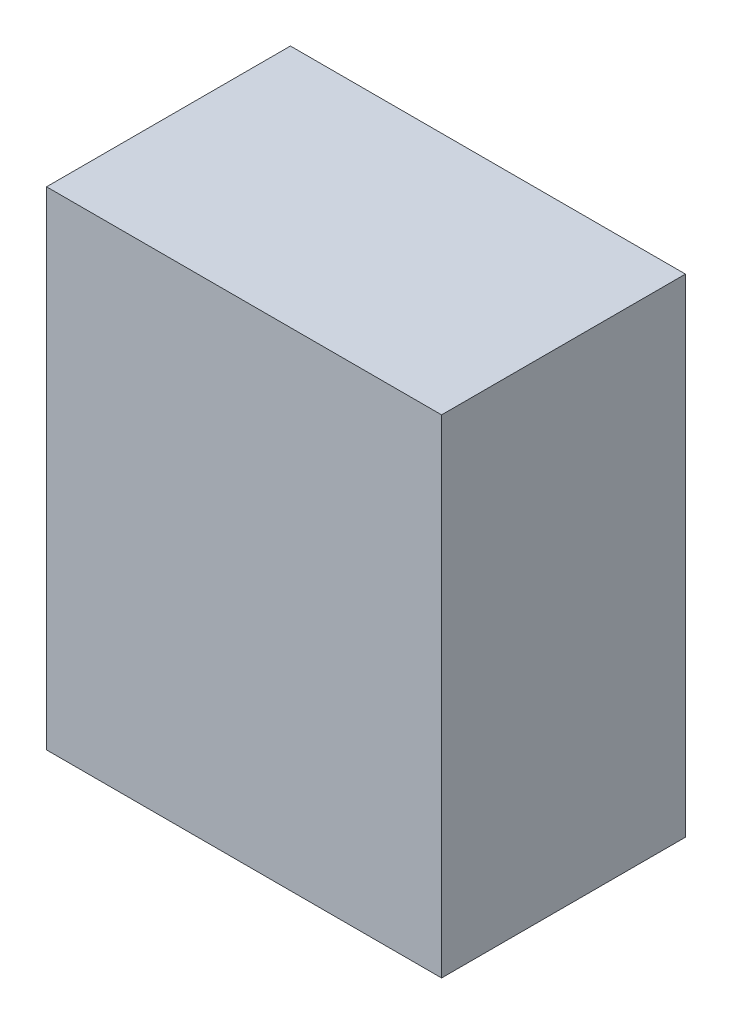
ISO-10303-21;
HEADER;
FILE_DESCRIPTION(('STEP AP214'),'2;1');
FILE_NAME('part.step','',(''),(''),'','','');
FILE_SCHEMA(('AUTOMOTIVE_DESIGN { 1 0 10303 214 1 1 1 1 }'));
ENDSEC;
DATA;
#1=APPLICATION_CONTEXT('core data for automotive mechanical design processes');
#2=APPLICATION_PROTOCOL_DEFINITION('international standard','automotive_design',2000,#1);
#3=PRODUCT_CONTEXT('',#1,'mechanical');
#4=PRODUCT('Part','Part','',(#3));
#5=PRODUCT_RELATED_PRODUCT_CATEGORY('part','',(#4));
#6=PRODUCT_DEFINITION_FORMATION('','',#4);
#7=PRODUCT_DEFINITION_CONTEXT('part definition',#1,'design');
#8=PRODUCT_DEFINITION('design','',#6,#7);
#9=PRODUCT_DEFINITION_SHAPE('','',#8);
#10=(LENGTH_UNIT() NAMED_UNIT(*) SI_UNIT(.MILLI.,.METRE.));
#11=(NAMED_UNIT(*) PLANE_ANGLE_UNIT() SI_UNIT($,.RADIAN.));
#12=(NAMED_UNIT(*) SI_UNIT($,.STERADIAN.) SOLID_ANGLE_UNIT());
#13=UNCERTAINTY_MEASURE_WITH_UNIT(LENGTH_MEASURE(1.E-05),#10,'distance_accuracy_value','');
#14=(GEOMETRIC_REPRESENTATION_CONTEXT(3) GLOBAL_UNCERTAINTY_ASSIGNED_CONTEXT((#13)) GLOBAL_UNIT_ASSIGNED_CONTEXT((#10,
#11,#12)) REPRESENTATION_CONTEXT('',''));
#15=CARTESIAN_POINT('',(0.,0.,0.));
#16=DIRECTION('',(0.,0.,1.));
#17=DIRECTION('',(1.,0.,0.));
#18=AXIS2_PLACEMENT_3D('',#15,#16,#17);
#19=CARTESIAN_POINT('',(0.,0.,-10.));
#20=DIRECTION('',(-1.,0.,0.));
#21=DIRECTION('',(0.,0.,1.));
#22=AXIS2_PLACEMENT_3D('',#19,#20,#21);
#23=PLANE('',#22);
#24=DIRECTION('',(0.,-1.,0.));
#25=VECTOR('',#24,1.);
#26=CARTESIAN_POINT('',(0.,0.,0.));
#27=LINE('',#26,#25);
#28=CARTESIAN_POINT('',(0.,20.,0.));
#29=VERTEX_POINT('',#28);
#30=CARTESIAN_POINT('',(0.,0.,0.));
#31=VERTEX_POINT('',#30);
#32=EDGE_CURVE('E107',#29,#31,#27,.T.);
#33=ORIENTED_EDGE('',*,*,#32,.F.);
#34=DIRECTION('',(0.,0.,1.));
#35=VECTOR('',#34,1.);
#36=CARTESIAN_POINT('',(0.,20.,-10.));
#37=LINE('',#36,#35);
#38=CARTESIAN_POINT('',(0.,20.,-10.));
#39=VERTEX_POINT('',#38);
#40=EDGE_CURVE('E11',#39,#29,#37,.T.);
#41=ORIENTED_EDGE('',*,*,#40,.F.);
#42=DIRECTION('',(0.,-1.,0.));
#43=VECTOR('',#42,1.);
#44=CARTESIAN_POINT('',(0.,0.,-10.));
#45=LINE('',#44,#43);
#46=CARTESIAN_POINT('',(0.,0.,-10.));
#47=VERTEX_POINT('',#46);
#48=EDGE_CURVE('E102',#39,#47,#45,.T.);
#49=ORIENTED_EDGE('',*,*,#48,.T.);
#50=DIRECTION('',(0.,0.,1.));
#51=VECTOR('',#50,1.);
#52=CARTESIAN_POINT('',(0.,0.,-10.));
#53=LINE('',#52,#51);
#54=EDGE_CURVE('E46',#47,#31,#53,.T.);
#55=ORIENTED_EDGE('',*,*,#54,.T.);
#56=EDGE_LOOP('',(#33,#41,#49,#55));
#57=FACE_BOUND('',#56,.T.);
#58=ADVANCED_FACE('F43',(#57),#23,.T.);
#59=CARTESIAN_POINT('',(0.,20.,-10.));
#60=DIRECTION('',(0.,1.,0.));
#61=DIRECTION('',(0.,0.,1.));
#62=AXIS2_PLACEMENT_3D('',#59,#60,#61);
#63=PLANE('',#62);
#64=DIRECTION('',(-1.,0.,0.));
#65=VECTOR('',#64,1.);
#66=CARTESIAN_POINT('',(0.,20.,0.));
#67=LINE('',#66,#65);
#68=CARTESIAN_POINT('',(16.2,20.,0.));
#69=VERTEX_POINT('',#68);
#70=EDGE_CURVE('E104',#69,#29,#67,.T.);
#71=ORIENTED_EDGE('',*,*,#70,.F.);
#72=DIRECTION('',(0.,0.,1.));
#73=VECTOR('',#72,1.);
#74=CARTESIAN_POINT('',(16.2,20.,-10.));
#75=LINE('',#74,#73);
#76=CARTESIAN_POINT('',(16.2,20.,-10.));
#77=VERTEX_POINT('',#76);
#78=EDGE_CURVE('E55',#77,#69,#75,.T.);
#79=ORIENTED_EDGE('',*,*,#78,.F.);
#80=DIRECTION('',(-1.,0.,0.));
#81=VECTOR('',#80,1.);
#82=CARTESIAN_POINT('',(0.,20.,-10.));
#83=LINE('',#82,#81);
#84=EDGE_CURVE('E97',#77,#39,#83,.T.);
#85=ORIENTED_EDGE('',*,*,#84,.T.);
#86=ORIENTED_EDGE('',*,*,#40,.T.);
#87=EDGE_LOOP('',(#71,#79,#85,#86));
#88=FACE_BOUND('',#87,.T.);
#89=ADVANCED_FACE('F117',(#88),#63,.T.);
#90=CARTESIAN_POINT('',(16.2,0.,-10.));
#91=DIRECTION('',(1.,0.,0.));
#92=DIRECTION('',(0.,0.,-1.));
#93=AXIS2_PLACEMENT_3D('',#90,#91,#92);
#94=PLANE('',#93);
#95=DIRECTION('',(0.,1.,0.));
#96=VECTOR('',#95,1.);
#97=CARTESIAN_POINT('',(16.2,0.,0.));
#98=LINE('',#97,#96);
#99=CARTESIAN_POINT('',(16.2,0.,0.));
#100=VERTEX_POINT('',#99);
#101=EDGE_CURVE('E93',#100,#69,#98,.T.);
#102=ORIENTED_EDGE('',*,*,#101,.F.);
#103=DIRECTION('',(0.,0.,1.));
#104=VECTOR('',#103,1.);
#105=CARTESIAN_POINT('',(16.2,0.,-10.));
#106=LINE('',#105,#104);
#107=CARTESIAN_POINT('',(16.2,0.,-10.));
#108=VERTEX_POINT('',#107);
#109=EDGE_CURVE('E88',#108,#100,#106,.T.);
#110=ORIENTED_EDGE('',*,*,#109,.F.);
#111=DIRECTION('',(0.,1.,0.));
#112=VECTOR('',#111,1.);
#113=CARTESIAN_POINT('',(16.2,0.,-10.));
#114=LINE('',#113,#112);
#115=EDGE_CURVE('E91',#108,#77,#114,.T.);
#116=ORIENTED_EDGE('',*,*,#115,.T.);
#117=ORIENTED_EDGE('',*,*,#78,.T.);
#118=EDGE_LOOP('',(#102,#110,#116,#117));
#119=FACE_BOUND('',#118,.T.);
#120=ADVANCED_FACE('F89',(#119),#94,.T.);
#121=CARTESIAN_POINT('',(0.,0.,-10.));
#122=DIRECTION('',(0.,-1.,0.));
#123=DIRECTION('',(0.,0.,-1.));
#124=AXIS2_PLACEMENT_3D('',#121,#122,#123);
#125=PLANE('',#124);
#126=DIRECTION('',(1.,0.,0.));
#127=VECTOR('',#126,1.);
#128=CARTESIAN_POINT('',(0.,0.,0.));
#129=LINE('',#128,#127);
#130=EDGE_CURVE('E110',#31,#100,#129,.T.);
#131=ORIENTED_EDGE('',*,*,#130,.F.);
#132=ORIENTED_EDGE('',*,*,#54,.F.);
#133=DIRECTION('',(1.,0.,0.));
#134=VECTOR('',#133,1.);
#135=CARTESIAN_POINT('',(0.,0.,-10.));
#136=LINE('',#135,#134);
#137=EDGE_CURVE('E100',#47,#108,#136,.T.);
#138=ORIENTED_EDGE('',*,*,#137,.T.);
#139=ORIENTED_EDGE('',*,*,#109,.T.);
#140=EDGE_LOOP('',(#131,#132,#138,#139));
#141=FACE_BOUND('',#140,.T.);
#142=ADVANCED_FACE('F99',(#141),#125,.T.);
#143=CARTESIAN_POINT('',(0.,0.,-10.));
#144=DIRECTION('',(0.,0.,-1.));
#145=DIRECTION('',(-1.,0.,0.));
#146=AXIS2_PLACEMENT_3D('',#143,#144,#145);
#147=PLANE('',#146);
#148=ORIENTED_EDGE('',*,*,#48,.F.);
#149=ORIENTED_EDGE('',*,*,#84,.F.);
#150=ORIENTED_EDGE('',*,*,#115,.F.);
#151=ORIENTED_EDGE('',*,*,#137,.F.);
#152=EDGE_LOOP('',(#148,#149,#150,#151));
#153=FACE_BOUND('',#152,.T.);
#154=ADVANCED_FACE('F96',(#153),#147,.T.);
#155=CARTESIAN_POINT('',(0.,0.,0.));
#156=DIRECTION('',(0.,0.,-1.));
#157=DIRECTION('',(-1.,0.,0.));
#158=AXIS2_PLACEMENT_3D('',#155,#156,#157);
#159=PLANE('',#158);
#160=ORIENTED_EDGE('',*,*,#32,.T.);
#161=ORIENTED_EDGE('',*,*,#130,.T.);
#162=ORIENTED_EDGE('',*,*,#101,.T.);
#163=ORIENTED_EDGE('',*,*,#70,.T.);
#164=EDGE_LOOP('',(#160,#161,#162,#163));
#165=FACE_BOUND('',#164,.T.);
#166=ADVANCED_FACE('F116',(#165),#159,.F.);
#167=CLOSED_SHELL('',(#58,#89,#120,#142,#154,#166));
#168=MANIFOLD_SOLID_BREP('B2',#167);
#169=ADVANCED_BREP_SHAPE_REPRESENTATION('',(#18,#168),#14);
#170=SHAPE_DEFINITION_REPRESENTATION(#9,#169);
ENDSEC;
END-ISO-10303-21;
